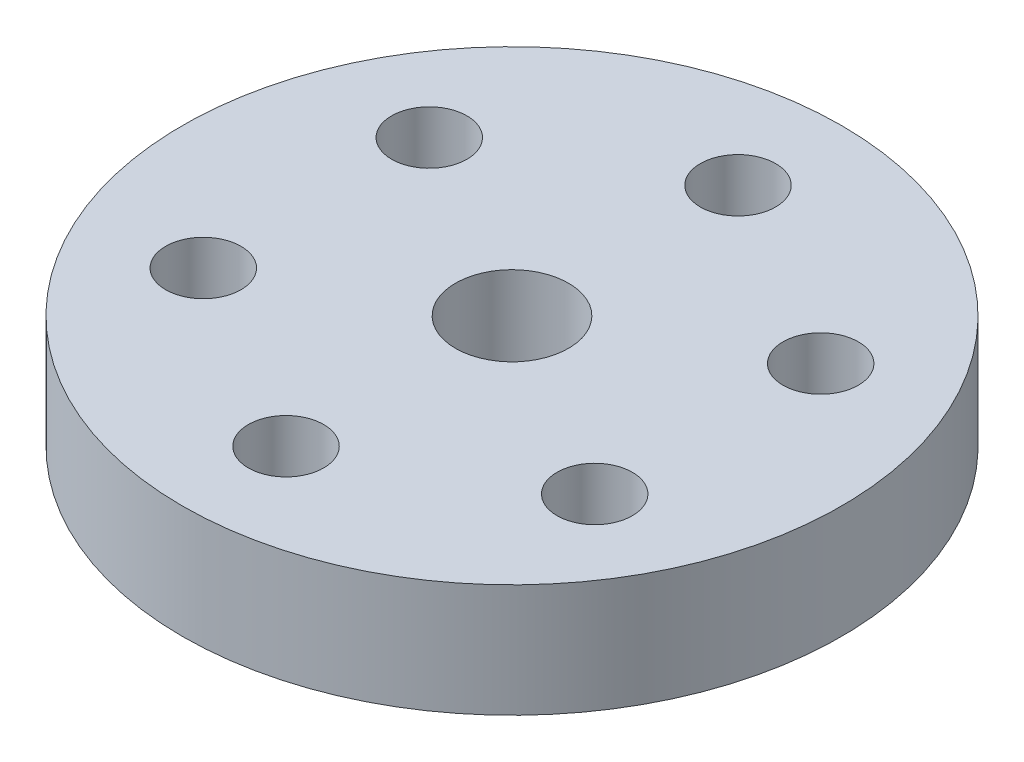
ISO-10303-21;
HEADER;
FILE_DESCRIPTION(('STEP AP214'),'2;1');
FILE_NAME('part.step','',(''),(''),'','','');
FILE_SCHEMA(('AUTOMOTIVE_DESIGN { 1 0 10303 214 1 1 1 1 }'));
ENDSEC;
DATA;
#1=APPLICATION_CONTEXT('core data for automotive mechanical design processes');
#2=APPLICATION_PROTOCOL_DEFINITION('international standard','automotive_design',2000,#1);
#3=PRODUCT_CONTEXT('',#1,'mechanical');
#4=PRODUCT('Part','Part','',(#3));
#5=PRODUCT_RELATED_PRODUCT_CATEGORY('part','',(#4));
#6=PRODUCT_DEFINITION_FORMATION('','',#4);
#7=PRODUCT_DEFINITION_CONTEXT('part definition',#1,'design');
#8=PRODUCT_DEFINITION('design','',#6,#7);
#9=PRODUCT_DEFINITION_SHAPE('','',#8);
#10=(LENGTH_UNIT() NAMED_UNIT(*) SI_UNIT(.MILLI.,.METRE.));
#11=(NAMED_UNIT(*) PLANE_ANGLE_UNIT() SI_UNIT($,.RADIAN.));
#12=(NAMED_UNIT(*) SI_UNIT($,.STERADIAN.) SOLID_ANGLE_UNIT());
#13=UNCERTAINTY_MEASURE_WITH_UNIT(LENGTH_MEASURE(1.E-05),#10,'distance_accuracy_value','');
#14=(GEOMETRIC_REPRESENTATION_CONTEXT(3) GLOBAL_UNCERTAINTY_ASSIGNED_CONTEXT((#13)) GLOBAL_UNIT_ASSIGNED_CONTEXT((#10,
#11,#12)) REPRESENTATION_CONTEXT('',''));
#15=CARTESIAN_POINT('',(0.,0.,0.));
#16=DIRECTION('',(0.,0.,1.));
#17=DIRECTION('',(1.,0.,0.));
#18=AXIS2_PLACEMENT_3D('',#15,#16,#17);
#19=CARTESIAN_POINT('',(0.,6.,0.));
#20=DIRECTION('',(0.,1.,0.));
#21=DIRECTION('',(0.,0.,1.));
#22=AXIS2_PLACEMENT_3D('',#19,#20,#21);
#23=PLANE('',#22);
#24=CARTESIAN_POINT('',(-10.3923048454122,6.,6.00000000000059));
#25=DIRECTION('',(0.,1.,0.));
#26=DIRECTION('',(0.,0.,1.));
#27=AXIS2_PLACEMENT_3D('',#24,#25,#26);
#28=CIRCLE('',#27,2.00000000000126);
#29=CARTESIAN_POINT('',(-10.3923048454122,6.,8.00000000000185));
#30=VERTEX_POINT('',#29);
#31=EDGE_CURVE('E78',#30,#30,#28,.T.);
#32=ORIENTED_EDGE('',*,*,#31,.F.);
#33=EDGE_LOOP('',(#32));
#34=FACE_BOUND('',#33,.T.);
#35=CARTESIAN_POINT('',(10.3923048454143,6.,5.99999999999941));
#36=DIRECTION('',(0.,1.,0.));
#37=DIRECTION('',(0.,0.,1.));
#38=AXIS2_PLACEMENT_3D('',#35,#36,#37);
#39=CIRCLE('',#38,2.00000000000086);
#40=CARTESIAN_POINT('',(10.3923048454143,6.,8.00000000000027));
#41=VERTEX_POINT('',#40);
#42=EDGE_CURVE('E66',#41,#41,#39,.T.);
#43=ORIENTED_EDGE('',*,*,#42,.F.);
#44=EDGE_LOOP('',(#43));
#45=FACE_BOUND('',#44,.T.);
#46=CARTESIAN_POINT('',(0.,6.,0.));
#47=DIRECTION('',(0.,1.,0.));
#48=DIRECTION('',(0.,0.,1.));
#49=AXIS2_PLACEMENT_3D('',#46,#47,#48);
#50=CIRCLE('',#49,3.);
#51=CARTESIAN_POINT('',(0.,6.,3.));
#52=VERTEX_POINT('',#51);
#53=EDGE_CURVE('E54',#52,#52,#50,.T.);
#54=ORIENTED_EDGE('',*,*,#53,.F.);
#55=EDGE_LOOP('',(#54));
#56=FACE_BOUND('',#55,.T.);
#57=CARTESIAN_POINT('',(0.,6.,0.));
#58=DIRECTION('',(0.,1.,0.));
#59=DIRECTION('',(0.,0.,1.));
#60=AXIS2_PLACEMENT_3D('',#57,#58,#59);
#61=CIRCLE('',#60,17.5);
#62=CARTESIAN_POINT('',(0.,6.,17.5));
#63=VERTEX_POINT('',#62);
#64=EDGE_CURVE('E10',#63,#63,#61,.T.);
#65=ORIENTED_EDGE('',*,*,#64,.T.);
#66=EDGE_LOOP('',(#65));
#67=FACE_BOUND('',#66,.T.);
#68=CARTESIAN_POINT('',(0.,6.,-12.));
#69=DIRECTION('',(0.,1.,0.));
#70=DIRECTION('',(0.,0.,1.));
#71=AXIS2_PLACEMENT_3D('',#68,#69,#70);
#72=CIRCLE('',#71,2.);
#73=CARTESIAN_POINT('',(0.,6.,-10.));
#74=VERTEX_POINT('',#73);
#75=EDGE_CURVE('E49',#74,#74,#72,.T.);
#76=ORIENTED_EDGE('',*,*,#75,.F.);
#77=EDGE_LOOP('',(#76));
#78=FACE_BOUND('',#77,.T.);
#79=CARTESIAN_POINT('',(10.3923048454136,6.,-6.00000000000059));
#80=DIRECTION('',(0.,1.,0.));
#81=DIRECTION('',(0.,0.,1.));
#82=AXIS2_PLACEMENT_3D('',#79,#80,#81);
#83=CIRCLE('',#82,2.00000000000019);
#84=CARTESIAN_POINT('',(10.3923048454136,6.,-4.00000000000041));
#85=VERTEX_POINT('',#84);
#86=EDGE_CURVE('E60',#85,#85,#83,.T.);
#87=ORIENTED_EDGE('',*,*,#86,.F.);
#88=EDGE_LOOP('',(#87));
#89=FACE_BOUND('',#88,.T.);
#90=CARTESIAN_POINT('',(1.35983332418246E-12,6.,12.));
#91=DIRECTION('',(0.,1.,0.));
#92=DIRECTION('',(0.,0.,1.));
#93=AXIS2_PLACEMENT_3D('',#90,#91,#92);
#94=CIRCLE('',#93,2.00000000000138);
#95=CARTESIAN_POINT('',(1.35983332418246E-12,6.,14.0000000000014));
#96=VERTEX_POINT('',#95);
#97=EDGE_CURVE('E72',#96,#96,#94,.T.);
#98=ORIENTED_EDGE('',*,*,#97,.F.);
#99=EDGE_LOOP('',(#98));
#100=FACE_BOUND('',#99,.T.);
#101=CARTESIAN_POINT('',(-10.3923048454129,6.,-5.9999999999994));
#102=DIRECTION('',(0.,1.,0.));
#103=DIRECTION('',(0.,0.,1.));
#104=AXIS2_PLACEMENT_3D('',#101,#102,#103);
#105=CIRCLE('',#104,2.00000000000064);
#106=CARTESIAN_POINT('',(-10.3923048454129,6.,-3.99999999999876));
#107=VERTEX_POINT('',#106);
#108=EDGE_CURVE('E84',#107,#107,#105,.T.);
#109=ORIENTED_EDGE('',*,*,#108,.F.);
#110=EDGE_LOOP('',(#109));
#111=FACE_BOUND('',#110,.T.);
#112=ADVANCED_FACE('F38',(#34,#45,#56,#67,#78,#89,#100,#111),#23,.T.);
#113=CARTESIAN_POINT('',(0.,0.,0.));
#114=DIRECTION('',(0.,1.,0.));
#115=DIRECTION('',(0.,0.,1.));
#116=AXIS2_PLACEMENT_3D('',#113,#114,#115);
#117=PLANE('',#116);
#118=CARTESIAN_POINT('',(0.,0.,0.));
#119=DIRECTION('',(0.,1.,0.));
#120=DIRECTION('',(0.,0.,1.));
#121=AXIS2_PLACEMENT_3D('',#118,#119,#120);
#122=CIRCLE('',#121,17.5);
#123=CARTESIAN_POINT('',(0.,0.,17.5));
#124=VERTEX_POINT('',#123);
#125=EDGE_CURVE('E42',#124,#124,#122,.T.);
#126=ORIENTED_EDGE('',*,*,#125,.F.);
#127=EDGE_LOOP('',(#126));
#128=FACE_BOUND('',#127,.T.);
#129=CARTESIAN_POINT('',(0.,0.,-12.));
#130=DIRECTION('',(0.,1.,0.));
#131=DIRECTION('',(0.,0.,1.));
#132=AXIS2_PLACEMENT_3D('',#129,#130,#131);
#133=CIRCLE('',#132,2.);
#134=CARTESIAN_POINT('',(0.,0.,-10.));
#135=VERTEX_POINT('',#134);
#136=EDGE_CURVE('E51',#135,#135,#133,.T.);
#137=ORIENTED_EDGE('',*,*,#136,.T.);
#138=EDGE_LOOP('',(#137));
#139=FACE_BOUND('',#138,.T.);
#140=CARTESIAN_POINT('',(0.,0.,0.));
#141=DIRECTION('',(0.,1.,0.));
#142=DIRECTION('',(0.,0.,1.));
#143=AXIS2_PLACEMENT_3D('',#140,#141,#142);
#144=CIRCLE('',#143,3.);
#145=CARTESIAN_POINT('',(0.,0.,3.));
#146=VERTEX_POINT('',#145);
#147=EDGE_CURVE('E57',#146,#146,#144,.T.);
#148=ORIENTED_EDGE('',*,*,#147,.T.);
#149=EDGE_LOOP('',(#148));
#150=FACE_BOUND('',#149,.T.);
#151=CARTESIAN_POINT('',(10.3923048454136,0.,-6.00000000000059));
#152=DIRECTION('',(0.,1.,0.));
#153=DIRECTION('',(0.,0.,1.));
#154=AXIS2_PLACEMENT_3D('',#151,#152,#153);
#155=CIRCLE('',#154,2.00000000000019);
#156=CARTESIAN_POINT('',(10.3923048454136,0.,-4.00000000000041));
#157=VERTEX_POINT('',#156);
#158=EDGE_CURVE('E63',#157,#157,#155,.T.);
#159=ORIENTED_EDGE('',*,*,#158,.T.);
#160=EDGE_LOOP('',(#159));
#161=FACE_BOUND('',#160,.T.);
#162=CARTESIAN_POINT('',(10.3923048454143,0.,5.99999999999941));
#163=DIRECTION('',(0.,1.,0.));
#164=DIRECTION('',(0.,0.,1.));
#165=AXIS2_PLACEMENT_3D('',#162,#163,#164);
#166=CIRCLE('',#165,2.00000000000086);
#167=CARTESIAN_POINT('',(10.3923048454143,0.,8.00000000000027));
#168=VERTEX_POINT('',#167);
#169=EDGE_CURVE('E69',#168,#168,#166,.T.);
#170=ORIENTED_EDGE('',*,*,#169,.T.);
#171=EDGE_LOOP('',(#170));
#172=FACE_BOUND('',#171,.T.);
#173=CARTESIAN_POINT('',(1.35983332418246E-12,0.,12.));
#174=DIRECTION('',(0.,1.,0.));
#175=DIRECTION('',(0.,0.,1.));
#176=AXIS2_PLACEMENT_3D('',#173,#174,#175);
#177=CIRCLE('',#176,2.00000000000138);
#178=CARTESIAN_POINT('',(1.35983332418246E-12,0.,14.0000000000014));
#179=VERTEX_POINT('',#178);
#180=EDGE_CURVE('E75',#179,#179,#177,.T.);
#181=ORIENTED_EDGE('',*,*,#180,.T.);
#182=EDGE_LOOP('',(#181));
#183=FACE_BOUND('',#182,.T.);
#184=CARTESIAN_POINT('',(-10.3923048454122,0.,6.00000000000059));
#185=DIRECTION('',(0.,1.,0.));
#186=DIRECTION('',(0.,0.,1.));
#187=AXIS2_PLACEMENT_3D('',#184,#185,#186);
#188=CIRCLE('',#187,2.00000000000126);
#189=CARTESIAN_POINT('',(-10.3923048454122,0.,8.00000000000185));
#190=VERTEX_POINT('',#189);
#191=EDGE_CURVE('E81',#190,#190,#188,.T.);
#192=ORIENTED_EDGE('',*,*,#191,.T.);
#193=EDGE_LOOP('',(#192));
#194=FACE_BOUND('',#193,.T.);
#195=CARTESIAN_POINT('',(-10.3923048454129,0.,-5.9999999999994));
#196=DIRECTION('',(0.,1.,0.));
#197=DIRECTION('',(0.,0.,1.));
#198=AXIS2_PLACEMENT_3D('',#195,#196,#197);
#199=CIRCLE('',#198,2.00000000000064);
#200=CARTESIAN_POINT('',(-10.3923048454129,0.,-3.99999999999876));
#201=VERTEX_POINT('',#200);
#202=EDGE_CURVE('E87',#201,#201,#199,.T.);
#203=ORIENTED_EDGE('',*,*,#202,.T.);
#204=EDGE_LOOP('',(#203));
#205=FACE_BOUND('',#204,.T.);
#206=ADVANCED_FACE('F97',(#128,#139,#150,#161,#172,#183,#194,#205),#117,.F.);
#207=CARTESIAN_POINT('',(0.,6.,0.));
#208=DIRECTION('',(0.,-1.,0.));
#209=DIRECTION('',(0.,0.,-1.));
#210=AXIS2_PLACEMENT_3D('',#207,#208,#209);
#211=CYLINDRICAL_SURFACE('',#210,17.5);
#212=ORIENTED_EDGE('',*,*,#64,.F.);
#213=EDGE_LOOP('',(#212));
#214=FACE_BOUND('',#213,.T.);
#215=ORIENTED_EDGE('',*,*,#125,.T.);
#216=EDGE_LOOP('',(#215));
#217=FACE_BOUND('',#216,.T.);
#218=ADVANCED_FACE('F40',(#214,#217),#211,.T.);
#219=CARTESIAN_POINT('',(0.,6.,-12.));
#220=DIRECTION('',(0.,-1.,0.));
#221=DIRECTION('',(0.,0.,-1.));
#222=AXIS2_PLACEMENT_3D('',#219,#220,#221);
#223=CYLINDRICAL_SURFACE('',#222,2.);
#224=ORIENTED_EDGE('',*,*,#75,.T.);
#225=EDGE_LOOP('',(#224));
#226=FACE_BOUND('',#225,.T.);
#227=ORIENTED_EDGE('',*,*,#136,.F.);
#228=EDGE_LOOP('',(#227));
#229=FACE_BOUND('',#228,.T.);
#230=ADVANCED_FACE('F107',(#226,#229),#223,.F.);
#231=CARTESIAN_POINT('',(0.,6.,0.));
#232=DIRECTION('',(0.,-1.,0.));
#233=DIRECTION('',(0.,0.,-1.));
#234=AXIS2_PLACEMENT_3D('',#231,#232,#233);
#235=CYLINDRICAL_SURFACE('',#234,3.);
#236=ORIENTED_EDGE('',*,*,#53,.T.);
#237=EDGE_LOOP('',(#236));
#238=FACE_BOUND('',#237,.T.);
#239=ORIENTED_EDGE('',*,*,#147,.F.);
#240=EDGE_LOOP('',(#239));
#241=FACE_BOUND('',#240,.T.);
#242=ADVANCED_FACE('F110',(#238,#241),#235,.F.);
#243=CARTESIAN_POINT('',(10.3923048454136,6.,-6.00000000000059));
#244=DIRECTION('',(0.,-1.,0.));
#245=DIRECTION('',(0.,0.,-1.));
#246=AXIS2_PLACEMENT_3D('',#243,#244,#245);
#247=CYLINDRICAL_SURFACE('',#246,2.00000000000019);
#248=ORIENTED_EDGE('',*,*,#86,.T.);
#249=EDGE_LOOP('',(#248));
#250=FACE_BOUND('',#249,.T.);
#251=ORIENTED_EDGE('',*,*,#158,.F.);
#252=EDGE_LOOP('',(#251));
#253=FACE_BOUND('',#252,.T.);
#254=ADVANCED_FACE('F114',(#250,#253),#247,.F.);
#255=CARTESIAN_POINT('',(10.3923048454143,6.,5.99999999999941));
#256=DIRECTION('',(0.,-1.,0.));
#257=DIRECTION('',(0.,0.,-1.));
#258=AXIS2_PLACEMENT_3D('',#255,#256,#257);
#259=CYLINDRICAL_SURFACE('',#258,2.00000000000086);
#260=ORIENTED_EDGE('',*,*,#42,.T.);
#261=EDGE_LOOP('',(#260));
#262=FACE_BOUND('',#261,.T.);
#263=ORIENTED_EDGE('',*,*,#169,.F.);
#264=EDGE_LOOP('',(#263));
#265=FACE_BOUND('',#264,.T.);
#266=ADVANCED_FACE('F118',(#262,#265),#259,.F.);
#267=CARTESIAN_POINT('',(1.35983332418246E-12,6.,12.));
#268=DIRECTION('',(0.,-1.,0.));
#269=DIRECTION('',(0.,0.,-1.));
#270=AXIS2_PLACEMENT_3D('',#267,#268,#269);
#271=CYLINDRICAL_SURFACE('',#270,2.00000000000138);
#272=ORIENTED_EDGE('',*,*,#97,.T.);
#273=EDGE_LOOP('',(#272));
#274=FACE_BOUND('',#273,.T.);
#275=ORIENTED_EDGE('',*,*,#180,.F.);
#276=EDGE_LOOP('',(#275));
#277=FACE_BOUND('',#276,.T.);
#278=ADVANCED_FACE('F122',(#274,#277),#271,.F.);
#279=CARTESIAN_POINT('',(-10.3923048454122,6.,6.00000000000059));
#280=DIRECTION('',(0.,-1.,0.));
#281=DIRECTION('',(0.,0.,-1.));
#282=AXIS2_PLACEMENT_3D('',#279,#280,#281);
#283=CYLINDRICAL_SURFACE('',#282,2.00000000000126);
#284=ORIENTED_EDGE('',*,*,#31,.T.);
#285=EDGE_LOOP('',(#284));
#286=FACE_BOUND('',#285,.T.);
#287=ORIENTED_EDGE('',*,*,#191,.F.);
#288=EDGE_LOOP('',(#287));
#289=FACE_BOUND('',#288,.T.);
#290=ADVANCED_FACE('F126',(#286,#289),#283,.F.);
#291=CARTESIAN_POINT('',(-10.3923048454129,6.,-5.9999999999994));
#292=DIRECTION('',(0.,-1.,0.));
#293=DIRECTION('',(0.,0.,-1.));
#294=AXIS2_PLACEMENT_3D('',#291,#292,#293);
#295=CYLINDRICAL_SURFACE('',#294,2.00000000000064);
#296=ORIENTED_EDGE('',*,*,#108,.T.);
#297=EDGE_LOOP('',(#296));
#298=FACE_BOUND('',#297,.T.);
#299=ORIENTED_EDGE('',*,*,#202,.F.);
#300=EDGE_LOOP('',(#299));
#301=FACE_BOUND('',#300,.T.);
#302=ADVANCED_FACE('F93',(#298,#301),#295,.F.);
#303=CLOSED_SHELL('',(#112,#206,#218,#230,#242,#254,#266,#278,#290,#302));
#304=MANIFOLD_SOLID_BREP('B2',#303);
#305=ADVANCED_BREP_SHAPE_REPRESENTATION('',(#18,#304),#14);
#306=SHAPE_DEFINITION_REPRESENTATION(#9,#305);
ENDSEC;
END-ISO-10303-21;
